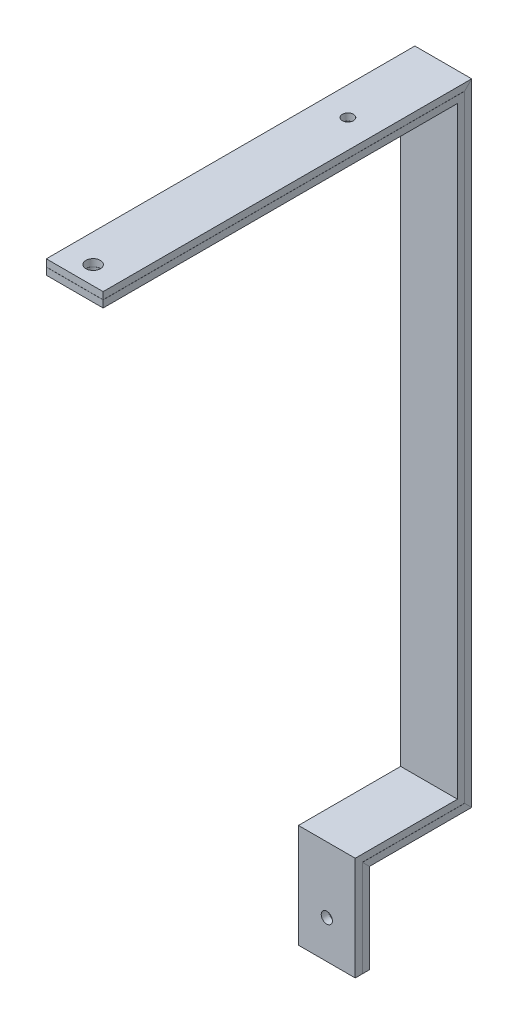
ISO-10303-21;
HEADER;
FILE_DESCRIPTION(('STEP AP214'),'2;1');
FILE_NAME('part.step','',(''),(''),'','','');
FILE_SCHEMA(('AUTOMOTIVE_DESIGN { 1 0 10303 214 1 1 1 1 }'));
ENDSEC;
DATA;
#1=APPLICATION_CONTEXT('core data for automotive mechanical design processes');
#2=APPLICATION_PROTOCOL_DEFINITION('international standard','automotive_design',2000,#1);
#3=PRODUCT_CONTEXT('',#1,'mechanical');
#4=PRODUCT('Part','Part','',(#3));
#5=PRODUCT_RELATED_PRODUCT_CATEGORY('part','',(#4));
#6=PRODUCT_DEFINITION_FORMATION('','',#4);
#7=PRODUCT_DEFINITION_CONTEXT('part definition',#1,'design');
#8=PRODUCT_DEFINITION('design','',#6,#7);
#9=PRODUCT_DEFINITION_SHAPE('','',#8);
#10=(LENGTH_UNIT() NAMED_UNIT(*) SI_UNIT(.MILLI.,.METRE.));
#11=(NAMED_UNIT(*) PLANE_ANGLE_UNIT() SI_UNIT($,.RADIAN.));
#12=(NAMED_UNIT(*) SI_UNIT($,.STERADIAN.) SOLID_ANGLE_UNIT());
#13=UNCERTAINTY_MEASURE_WITH_UNIT(LENGTH_MEASURE(1.E-05),#10,'distance_accuracy_value','');
#14=(GEOMETRIC_REPRESENTATION_CONTEXT(3) GLOBAL_UNCERTAINTY_ASSIGNED_CONTEXT((#13)) GLOBAL_UNIT_ASSIGNED_CONTEXT((#10,
#11,#12)) REPRESENTATION_CONTEXT('',''));
#15=CARTESIAN_POINT('',(0.,0.,0.));
#16=DIRECTION('',(0.,0.,1.));
#17=DIRECTION('',(1.,0.,0.));
#18=AXIS2_PLACEMENT_3D('',#15,#16,#17);
#19=CARTESIAN_POINT('',(-25.4,-3.255,0.));
#20=DIRECTION('',(0.,0.,1.));
#21=DIRECTION('',(1.,0.,0.));
#22=AXIS2_PLACEMENT_3D('',#19,#20,#21);
#23=PLANE('',#22);
#24=DIRECTION('',(0.,-1.,0.));
#25=VECTOR('',#24,1.);
#26=CARTESIAN_POINT('',(25.4,-3.255,0.));
#27=LINE('',#26,#25);
#28=CARTESIAN_POINT('',(25.4,-3.255,0.));
#29=VERTEX_POINT('',#28);
#30=CARTESIAN_POINT('',(25.4,-9.565,0.));
#31=VERTEX_POINT('',#30);
#32=EDGE_CURVE('E153',#29,#31,#27,.T.);
#33=ORIENTED_EDGE('',*,*,#32,.F.);
#34=DIRECTION('',(1.,0.,0.));
#35=VECTOR('',#34,1.);
#36=CARTESIAN_POINT('',(-25.4,-3.255,0.));
#37=LINE('',#36,#35);
#38=CARTESIAN_POINT('',(-25.4,-3.255,0.));
#39=VERTEX_POINT('',#38);
#40=EDGE_CURVE('E12',#39,#29,#37,.T.);
#41=ORIENTED_EDGE('',*,*,#40,.F.);
#42=DIRECTION('',(0.,-1.,0.));
#43=VECTOR('',#42,1.);
#44=CARTESIAN_POINT('',(-25.4,-3.255,0.));
#45=LINE('',#44,#43);
#46=CARTESIAN_POINT('',(-25.4,-9.565,0.));
#47=VERTEX_POINT('',#46);
#48=EDGE_CURVE('E180',#39,#47,#45,.T.);
#49=ORIENTED_EDGE('',*,*,#48,.T.);
#50=DIRECTION('',(1.,0.,0.));
#51=VECTOR('',#50,1.);
#52=CARTESIAN_POINT('',(-25.4,-9.565,0.));
#53=LINE('',#52,#51);
#54=EDGE_CURVE('E105',#47,#31,#53,.T.);
#55=ORIENTED_EDGE('',*,*,#54,.T.);
#56=EDGE_LOOP('',(#33,#41,#49,#55));
#57=FACE_BOUND('',#56,.T.);
#58=ADVANCED_FACE('F43',(#57),#23,.T.);
#59=CARTESIAN_POINT('',(-25.4,-3.255,0.));
#60=DIRECTION('',(0.,1.,0.));
#61=DIRECTION('',(0.,0.,1.));
#62=AXIS2_PLACEMENT_3D('',#59,#60,#61);
#63=PLANE('',#62);
#64=CARTESIAN_POINT('',(7.93595550972163E-12,-3.255,-16.5000000000056));
#65=DIRECTION('',(0.,1.,0.));
#66=DIRECTION('',(0.,0.,1.));
#67=AXIS2_PLACEMENT_3D('',#64,#65,#66);
#68=CIRCLE('',#67,6.49999999999943);
#69=CARTESIAN_POINT('',(7.93595550972163E-12,-3.255,-10.0000000000061));
#70=VERTEX_POINT('',#69);
#71=EDGE_CURVE('E196',#70,#70,#68,.T.);
#72=ORIENTED_EDGE('',*,*,#71,.F.);
#73=EDGE_LOOP('',(#72));
#74=FACE_BOUND('',#73,.T.);
#75=CARTESIAN_POINT('',(0.,-3.255,-244.195));
#76=DIRECTION('',(0.,1.,0.));
#77=DIRECTION('',(0.,0.,1.));
#78=AXIS2_PLACEMENT_3D('',#75,#76,#77);
#79=CIRCLE('',#78,5.);
#80=CARTESIAN_POINT('',(0.,-3.255,-239.195));
#81=VERTEX_POINT('',#80);
#82=EDGE_CURVE('E157',#81,#81,#79,.T.);
#83=ORIENTED_EDGE('',*,*,#82,.F.);
#84=EDGE_LOOP('',(#83));
#85=FACE_BOUND('',#84,.T.);
#86=DIRECTION('',(0.,0.,1.));
#87=VECTOR('',#86,1.);
#88=CARTESIAN_POINT('',(25.4,-3.255,0.));
#89=LINE('',#88,#87);
#90=CARTESIAN_POINT('',(25.4,-3.255,-323.085));
#91=VERTEX_POINT('',#90);
#92=EDGE_CURVE('E178',#91,#29,#89,.T.);
#93=ORIENTED_EDGE('',*,*,#92,.F.);
#94=DIRECTION('',(1.,0.,0.));
#95=VECTOR('',#94,1.);
#96=CARTESIAN_POINT('',(-25.4,-3.255,-323.085));
#97=LINE('',#96,#95);
#98=CARTESIAN_POINT('',(-25.4,-3.255,-323.085));
#99=VERTEX_POINT('',#98);
#100=EDGE_CURVE('E52',#99,#91,#97,.T.);
#101=ORIENTED_EDGE('',*,*,#100,.F.);
#102=DIRECTION('',(0.,0.,1.));
#103=VECTOR('',#102,1.);
#104=CARTESIAN_POINT('',(-25.4,-3.255,0.));
#105=LINE('',#104,#103);
#106=EDGE_CURVE('E143',#99,#39,#105,.T.);
#107=ORIENTED_EDGE('',*,*,#106,.T.);
#108=ORIENTED_EDGE('',*,*,#40,.T.);
#109=EDGE_LOOP('',(#93,#101,#107,#108));
#110=FACE_BOUND('',#109,.T.);
#111=ADVANCED_FACE('F242',(#74,#85,#110),#63,.T.);
#112=CARTESIAN_POINT('',(-25.4,-3.255,-323.085));
#113=DIRECTION('',(0.,0.,-1.));
#114=DIRECTION('',(0.,1.,0.));
#115=AXIS2_PLACEMENT_3D('',#112,#113,#114);
#116=PLANE('',#115);
#117=DIRECTION('',(0.,1.,0.));
#118=VECTOR('',#117,1.);
#119=CARTESIAN_POINT('',(25.4,-3.255,-323.085));
#120=LINE('',#119,#118);
#121=CARTESIAN_POINT('',(25.4,-554.505,-323.085));
#122=VERTEX_POINT('',#121);
#123=EDGE_CURVE('E130',#122,#91,#120,.T.);
#124=ORIENTED_EDGE('',*,*,#123,.F.);
#125=DIRECTION('',(1.,0.,0.));
#126=VECTOR('',#125,1.);
#127=CARTESIAN_POINT('',(-25.4,-554.505,-323.085));
#128=LINE('',#127,#126);
#129=CARTESIAN_POINT('',(-25.4,-554.505,-323.085));
#130=VERTEX_POINT('',#129);
#131=EDGE_CURVE('E125',#130,#122,#128,.T.);
#132=ORIENTED_EDGE('',*,*,#131,.F.);
#133=DIRECTION('',(0.,1.,0.));
#134=VECTOR('',#133,1.);
#135=CARTESIAN_POINT('',(-25.4,-3.255,-323.085));
#136=LINE('',#135,#134);
#137=EDGE_CURVE('E128',#130,#99,#136,.T.);
#138=ORIENTED_EDGE('',*,*,#137,.T.);
#139=ORIENTED_EDGE('',*,*,#100,.T.);
#140=EDGE_LOOP('',(#124,#132,#138,#139));
#141=FACE_BOUND('',#140,.T.);
#142=ADVANCED_FACE('F127',(#141),#116,.T.);
#143=CARTESIAN_POINT('',(-25.4,-554.505,-323.085));
#144=DIRECTION('',(0.,-1.,0.));
#145=DIRECTION('',(0.,0.,-1.));
#146=AXIS2_PLACEMENT_3D('',#143,#144,#145);
#147=PLANE('',#146);
#148=DIRECTION('',(0.,0.,-1.));
#149=VECTOR('',#148,1.);
#150=CARTESIAN_POINT('',(25.4,-554.505,-323.085));
#151=LINE('',#150,#149);
#152=CARTESIAN_POINT('',(25.4,-554.505,-231.681165));
#153=VERTEX_POINT('',#152);
#154=EDGE_CURVE('E175',#153,#122,#151,.T.);
#155=ORIENTED_EDGE('',*,*,#154,.F.);
#156=DIRECTION('',(1.,0.,0.));
#157=VECTOR('',#156,1.);
#158=CARTESIAN_POINT('',(-25.4,-554.505,-231.681165));
#159=LINE('',#158,#157);
#160=CARTESIAN_POINT('',(-25.4,-554.505,-231.681165));
#161=VERTEX_POINT('',#160);
#162=EDGE_CURVE('E135',#161,#153,#159,.T.);
#163=ORIENTED_EDGE('',*,*,#162,.F.);
#164=DIRECTION('',(0.,0.,-1.));
#165=VECTOR('',#164,1.);
#166=CARTESIAN_POINT('',(-25.4,-554.505,-323.085));
#167=LINE('',#166,#165);
#168=EDGE_CURVE('E141',#161,#130,#167,.T.);
#169=ORIENTED_EDGE('',*,*,#168,.T.);
#170=ORIENTED_EDGE('',*,*,#131,.T.);
#171=EDGE_LOOP('',(#155,#163,#169,#170));
#172=FACE_BOUND('',#171,.T.);
#173=ADVANCED_FACE('F145',(#172),#147,.T.);
#174=CARTESIAN_POINT('',(-25.4,-554.505,-231.681165));
#175=DIRECTION('',(0.,0.,-1.));
#176=DIRECTION('',(-1.,0.,0.));
#177=AXIS2_PLACEMENT_3D('',#174,#175,#176);
#178=PLANE('',#177);
#179=CARTESIAN_POINT('',(0.,-606.92,-231.681165));
#180=DIRECTION('',(0.,0.,-1.));
#181=DIRECTION('',(-1.,0.,0.));
#182=AXIS2_PLACEMENT_3D('',#179,#180,#181);
#183=CIRCLE('',#182,5.);
#184=CARTESIAN_POINT('',(-5.,-606.92,-231.681165));
#185=VERTEX_POINT('',#184);
#186=EDGE_CURVE('E206',#185,#185,#183,.T.);
#187=ORIENTED_EDGE('',*,*,#186,.F.);
#188=EDGE_LOOP('',(#187));
#189=FACE_BOUND('',#188,.T.);
#190=DIRECTION('',(0.,1.,0.));
#191=VECTOR('',#190,1.);
#192=CARTESIAN_POINT('',(25.4,-554.505,-231.681165));
#193=LINE('',#192,#191);
#194=CARTESIAN_POINT('',(25.4,-640.92,-231.681165));
#195=VERTEX_POINT('',#194);
#196=EDGE_CURVE('E172',#195,#153,#193,.T.);
#197=ORIENTED_EDGE('',*,*,#196,.F.);
#198=DIRECTION('',(1.,0.,0.));
#199=VECTOR('',#198,1.);
#200=CARTESIAN_POINT('',(-25.4,-640.92,-231.681165));
#201=LINE('',#200,#199);
#202=CARTESIAN_POINT('',(-25.4,-640.92,-231.681165));
#203=VERTEX_POINT('',#202);
#204=EDGE_CURVE('E184',#203,#195,#201,.T.);
#205=ORIENTED_EDGE('',*,*,#204,.F.);
#206=DIRECTION('',(0.,1.,0.));
#207=VECTOR('',#206,1.);
#208=CARTESIAN_POINT('',(-25.4,-554.505,-231.681165));
#209=LINE('',#208,#207);
#210=EDGE_CURVE('E146',#203,#161,#209,.T.);
#211=ORIENTED_EDGE('',*,*,#210,.T.);
#212=ORIENTED_EDGE('',*,*,#162,.T.);
#213=EDGE_LOOP('',(#197,#205,#211,#212));
#214=FACE_BOUND('',#213,.T.);
#215=ADVANCED_FACE('F257',(#189,#214),#178,.T.);
#216=CARTESIAN_POINT('',(-25.4,-640.92,-225.371165));
#217=DIRECTION('',(0.,-1.,0.));
#218=DIRECTION('',(0.,0.,-1.));
#219=AXIS2_PLACEMENT_3D('',#216,#217,#218);
#220=PLANE('',#219);
#221=DIRECTION('',(0.,0.,-1.));
#222=VECTOR('',#221,1.);
#223=CARTESIAN_POINT('',(25.4,-640.92,-225.371165));
#224=LINE('',#223,#222);
#225=CARTESIAN_POINT('',(25.4,-640.92,-225.371165));
#226=VERTEX_POINT('',#225);
#227=EDGE_CURVE('E169',#226,#195,#224,.T.);
#228=ORIENTED_EDGE('',*,*,#227,.F.);
#229=DIRECTION('',(1.,0.,0.));
#230=VECTOR('',#229,1.);
#231=CARTESIAN_POINT('',(-25.4,-640.92,-225.371165));
#232=LINE('',#231,#230);
#233=CARTESIAN_POINT('',(-25.4,-640.92,-225.371165));
#234=VERTEX_POINT('',#233);
#235=EDGE_CURVE('E186',#234,#226,#232,.T.);
#236=ORIENTED_EDGE('',*,*,#235,.F.);
#237=DIRECTION('',(0.,0.,-1.));
#238=VECTOR('',#237,1.);
#239=CARTESIAN_POINT('',(-25.4,-640.92,-225.371165));
#240=LINE('',#239,#238);
#241=EDGE_CURVE('E148',#234,#203,#240,.T.);
#242=ORIENTED_EDGE('',*,*,#241,.T.);
#243=ORIENTED_EDGE('',*,*,#204,.T.);
#244=EDGE_LOOP('',(#228,#236,#242,#243));
#245=FACE_BOUND('',#244,.T.);
#246=ADVANCED_FACE('F225',(#245),#220,.T.);
#247=CARTESIAN_POINT('',(-25.4,-548.195,-225.371165));
#248=DIRECTION('',(0.,0.,1.));
#249=DIRECTION('',(1.,0.,0.));
#250=AXIS2_PLACEMENT_3D('',#247,#248,#249);
#251=PLANE('',#250);
#252=CARTESIAN_POINT('',(0.,-606.92,-225.371165));
#253=DIRECTION('',(0.,0.,1.));
#254=DIRECTION('',(1.,0.,0.));
#255=AXIS2_PLACEMENT_3D('',#252,#253,#254);
#256=CIRCLE('',#255,5.);
#257=CARTESIAN_POINT('',(5.,-606.92,-225.371165));
#258=VERTEX_POINT('',#257);
#259=EDGE_CURVE('E381',#258,#258,#256,.T.);
#260=ORIENTED_EDGE('',*,*,#259,.F.);
#261=EDGE_LOOP('',(#260));
#262=FACE_BOUND('',#261,.T.);
#263=DIRECTION('',(0.,-1.,0.));
#264=VECTOR('',#263,1.);
#265=CARTESIAN_POINT('',(25.4,-548.195,-225.371165));
#266=LINE('',#265,#264);
#267=CARTESIAN_POINT('',(25.4,-548.195,-225.371165));
#268=VERTEX_POINT('',#267);
#269=EDGE_CURVE('E166',#268,#226,#266,.T.);
#270=ORIENTED_EDGE('',*,*,#269,.F.);
#271=DIRECTION('',(1.,0.,0.));
#272=VECTOR('',#271,1.);
#273=CARTESIAN_POINT('',(-25.4,-548.195,-225.371165));
#274=LINE('',#273,#272);
#275=CARTESIAN_POINT('',(-25.4,-548.195,-225.371165));
#276=VERTEX_POINT('',#275);
#277=EDGE_CURVE('E188',#276,#268,#274,.T.);
#278=ORIENTED_EDGE('',*,*,#277,.F.);
#279=DIRECTION('',(0.,-1.,0.));
#280=VECTOR('',#279,1.);
#281=CARTESIAN_POINT('',(-25.4,-548.195,-225.371165));
#282=LINE('',#281,#280);
#283=EDGE_CURVE('E219',#276,#234,#282,.T.);
#284=ORIENTED_EDGE('',*,*,#283,.T.);
#285=ORIENTED_EDGE('',*,*,#235,.T.);
#286=EDGE_LOOP('',(#270,#278,#284,#285));
#287=FACE_BOUND('',#286,.T.);
#288=ADVANCED_FACE('F231',(#262,#287),#251,.T.);
#289=CARTESIAN_POINT('',(-25.4,-548.195,-316.775));
#290=DIRECTION('',(0.,1.,0.));
#291=DIRECTION('',(0.,0.,1.));
#292=AXIS2_PLACEMENT_3D('',#289,#290,#291);
#293=PLANE('',#292);
#294=DIRECTION('',(0.,0.,1.));
#295=VECTOR('',#294,1.);
#296=CARTESIAN_POINT('',(25.4,-548.195,-316.775));
#297=LINE('',#296,#295);
#298=CARTESIAN_POINT('',(25.4,-548.195,-316.775));
#299=VERTEX_POINT('',#298);
#300=EDGE_CURVE('E163',#299,#268,#297,.T.);
#301=ORIENTED_EDGE('',*,*,#300,.F.);
#302=DIRECTION('',(1.,0.,0.));
#303=VECTOR('',#302,1.);
#304=CARTESIAN_POINT('',(-25.4,-548.195,-316.775));
#305=LINE('',#304,#303);
#306=CARTESIAN_POINT('',(-25.4,-548.195,-316.775));
#307=VERTEX_POINT('',#306);
#308=EDGE_CURVE('E190',#307,#299,#305,.T.);
#309=ORIENTED_EDGE('',*,*,#308,.F.);
#310=DIRECTION('',(0.,0.,1.));
#311=VECTOR('',#310,1.);
#312=CARTESIAN_POINT('',(-25.4,-548.195,-316.775));
#313=LINE('',#312,#311);
#314=EDGE_CURVE('E216',#307,#276,#313,.T.);
#315=ORIENTED_EDGE('',*,*,#314,.T.);
#316=ORIENTED_EDGE('',*,*,#277,.T.);
#317=EDGE_LOOP('',(#301,#309,#315,#316));
#318=FACE_BOUND('',#317,.T.);
#319=ADVANCED_FACE('F234',(#318),#293,.T.);
#320=CARTESIAN_POINT('',(-25.4,-9.565,-316.775));
#321=DIRECTION('',(0.,0.,1.));
#322=DIRECTION('',(0.,-1.,0.));
#323=AXIS2_PLACEMENT_3D('',#320,#321,#322);
#324=PLANE('',#323);
#325=DIRECTION('',(0.,-1.,0.));
#326=VECTOR('',#325,1.);
#327=CARTESIAN_POINT('',(25.4,-9.565,-316.775));
#328=LINE('',#327,#326);
#329=CARTESIAN_POINT('',(25.4,-9.565,-316.775));
#330=VERTEX_POINT('',#329);
#331=EDGE_CURVE('E160',#330,#299,#328,.T.);
#332=ORIENTED_EDGE('',*,*,#331,.F.);
#333=DIRECTION('',(1.,0.,0.));
#334=VECTOR('',#333,1.);
#335=CARTESIAN_POINT('',(-25.4,-9.565,-316.775));
#336=LINE('',#335,#334);
#337=CARTESIAN_POINT('',(-25.4,-9.565,-316.775));
#338=VERTEX_POINT('',#337);
#339=EDGE_CURVE('E192',#338,#330,#336,.T.);
#340=ORIENTED_EDGE('',*,*,#339,.F.);
#341=DIRECTION('',(0.,-1.,0.));
#342=VECTOR('',#341,1.);
#343=CARTESIAN_POINT('',(-25.4,-9.565,-316.775));
#344=LINE('',#343,#342);
#345=EDGE_CURVE('E213',#338,#307,#344,.T.);
#346=ORIENTED_EDGE('',*,*,#345,.T.);
#347=ORIENTED_EDGE('',*,*,#308,.T.);
#348=EDGE_LOOP('',(#332,#340,#346,#347));
#349=FACE_BOUND('',#348,.T.);
#350=ADVANCED_FACE('F238',(#349),#324,.T.);
#351=CARTESIAN_POINT('',(-25.4,-9.565,0.));
#352=DIRECTION('',(0.,-1.,0.));
#353=DIRECTION('',(0.,0.,-1.));
#354=AXIS2_PLACEMENT_3D('',#351,#352,#353);
#355=PLANE('',#354);
#356=CARTESIAN_POINT('',(7.93595550972163E-12,-9.565,-16.5000000000056));
#357=DIRECTION('',(0.,-1.,0.));
#358=DIRECTION('',(0.,0.,-1.));
#359=AXIS2_PLACEMENT_3D('',#356,#357,#358);
#360=CIRCLE('',#359,6.49999999999943);
#361=CARTESIAN_POINT('',(7.93595550972163E-12,-9.565,-23.000000000005));
#362=VERTEX_POINT('',#361);
#363=EDGE_CURVE('E46',#362,#362,#360,.T.);
#364=ORIENTED_EDGE('',*,*,#363,.F.);
#365=EDGE_LOOP('',(#364));
#366=FACE_BOUND('',#365,.T.);
#367=CARTESIAN_POINT('',(0.,-9.565,-244.195));
#368=DIRECTION('',(0.,-1.,0.));
#369=DIRECTION('',(0.,0.,-1.));
#370=AXIS2_PLACEMENT_3D('',#367,#368,#369);
#371=CIRCLE('',#370,5.);
#372=CARTESIAN_POINT('',(0.,-9.565,-249.195));
#373=VERTEX_POINT('',#372);
#374=EDGE_CURVE('E194',#373,#373,#371,.T.);
#375=ORIENTED_EDGE('',*,*,#374,.F.);
#376=EDGE_LOOP('',(#375));
#377=FACE_BOUND('',#376,.T.);
#378=DIRECTION('',(0.,0.,-1.));
#379=VECTOR('',#378,1.);
#380=CARTESIAN_POINT('',(25.4,-9.565,0.));
#381=LINE('',#380,#379);
#382=EDGE_CURVE('E156',#31,#330,#381,.T.);
#383=ORIENTED_EDGE('',*,*,#382,.F.);
#384=ORIENTED_EDGE('',*,*,#54,.F.);
#385=DIRECTION('',(0.,0.,-1.));
#386=VECTOR('',#385,1.);
#387=CARTESIAN_POINT('',(-25.4,-9.565,0.));
#388=LINE('',#387,#386);
#389=EDGE_CURVE('E211',#47,#338,#388,.T.);
#390=ORIENTED_EDGE('',*,*,#389,.T.);
#391=ORIENTED_EDGE('',*,*,#339,.T.);
#392=EDGE_LOOP('',(#383,#384,#390,#391));
#393=FACE_BOUND('',#392,.T.);
#394=ADVANCED_FACE('F239',(#366,#377,#393),#355,.T.);
#395=CARTESIAN_POINT('',(-25.4,0.,0.));
#396=DIRECTION('',(1.,0.,0.));
#397=DIRECTION('',(0.,0.,-1.));
#398=AXIS2_PLACEMENT_3D('',#395,#396,#397);
#399=PLANE('',#398);
#400=ORIENTED_EDGE('',*,*,#48,.F.);
#401=ORIENTED_EDGE('',*,*,#106,.F.);
#402=ORIENTED_EDGE('',*,*,#137,.F.);
#403=ORIENTED_EDGE('',*,*,#168,.F.);
#404=ORIENTED_EDGE('',*,*,#210,.F.);
#405=ORIENTED_EDGE('',*,*,#241,.F.);
#406=ORIENTED_EDGE('',*,*,#283,.F.);
#407=ORIENTED_EDGE('',*,*,#314,.F.);
#408=ORIENTED_EDGE('',*,*,#345,.F.);
#409=ORIENTED_EDGE('',*,*,#389,.F.);
#410=EDGE_LOOP('',(#400,#401,#402,#403,#404,#405,#406,#407,#408,#409));
#411=FACE_BOUND('',#410,.T.);
#412=ADVANCED_FACE('F139',(#411),#399,.F.);
#413=CARTESIAN_POINT('',(25.4,0.,0.));
#414=DIRECTION('',(1.,0.,0.));
#415=DIRECTION('',(0.,0.,-1.));
#416=AXIS2_PLACEMENT_3D('',#413,#414,#415);
#417=PLANE('',#416);
#418=ORIENTED_EDGE('',*,*,#32,.T.);
#419=ORIENTED_EDGE('',*,*,#382,.T.);
#420=ORIENTED_EDGE('',*,*,#331,.T.);
#421=ORIENTED_EDGE('',*,*,#300,.T.);
#422=ORIENTED_EDGE('',*,*,#269,.T.);
#423=ORIENTED_EDGE('',*,*,#227,.T.);
#424=ORIENTED_EDGE('',*,*,#196,.T.);
#425=ORIENTED_EDGE('',*,*,#154,.T.);
#426=ORIENTED_EDGE('',*,*,#123,.T.);
#427=ORIENTED_EDGE('',*,*,#92,.T.);
#428=EDGE_LOOP('',(#418,#419,#420,#421,#422,#423,#424,#425,#426,#427));
#429=FACE_BOUND('',#428,.T.);
#430=ADVANCED_FACE('F241',(#429),#417,.T.);
#431=CARTESIAN_POINT('',(0.,-36.845,-244.195));
#432=DIRECTION('',(0.,1.,0.));
#433=DIRECTION('',(0.,0.,1.));
#434=AXIS2_PLACEMENT_3D('',#431,#432,#433);
#435=CYLINDRICAL_SURFACE('',#434,5.);
#436=ORIENTED_EDGE('',*,*,#82,.T.);
#437=EDGE_LOOP('',(#436));
#438=FACE_BOUND('',#437,.T.);
#439=ORIENTED_EDGE('',*,*,#374,.T.);
#440=EDGE_LOOP('',(#439));
#441=FACE_BOUND('',#440,.T.);
#442=ADVANCED_FACE('F280',(#438,#441),#435,.F.);
#443=CARTESIAN_POINT('',(7.93595550972163E-12,-46.845,-16.5000000000056));
#444=DIRECTION('',(0.,1.,0.));
#445=DIRECTION('',(0.,0.,1.));
#446=AXIS2_PLACEMENT_3D('',#443,#444,#445);
#447=CYLINDRICAL_SURFACE('',#446,6.49999999999943);
#448=ORIENTED_EDGE('',*,*,#71,.T.);
#449=EDGE_LOOP('',(#448));
#450=FACE_BOUND('',#449,.T.);
#451=ORIENTED_EDGE('',*,*,#363,.T.);
#452=EDGE_LOOP('',(#451));
#453=FACE_BOUND('',#452,.T.);
#454=ADVANCED_FACE('F277',(#450,#453),#447,.F.);
#455=CARTESIAN_POINT('',(0.,-606.92,-251.371165));
#456=DIRECTION('',(0.,0.,1.));
#457=DIRECTION('',(1.,0.,0.));
#458=AXIS2_PLACEMENT_3D('',#455,#456,#457);
#459=CYLINDRICAL_SURFACE('',#458,5.);
#460=ORIENTED_EDGE('',*,*,#186,.T.);
#461=EDGE_LOOP('',(#460));
#462=FACE_BOUND('',#461,.T.);
#463=ORIENTED_EDGE('',*,*,#259,.T.);
#464=EDGE_LOOP('',(#463));
#465=FACE_BOUND('',#464,.T.);
#466=ADVANCED_FACE('F279',(#462,#465),#459,.F.);
#467=CLOSED_SHELL('',(#58,#111,#142,#173,#215,#246,#288,#319,#350,#394,#412,#430,#442,#454,#466));
#468=MANIFOLD_SOLID_BREP('B2',#467);
#469=CARTESIAN_POINT('',(0.,-640.92,-234.936165));
#470=DIRECTION('',(0.,1.,0.));
#471=DIRECTION('',(1.,0.,0.));
#472=AXIS2_PLACEMENT_3D('',#469,#470,#471);
#473=PLANE('',#472);
#474=DIRECTION('',(0.,0.,-1.));
#475=VECTOR('',#474,1.);
#476=CARTESIAN_POINT('',(25.4,-640.92,-238.091165));
#477=LINE('',#476,#475);
#478=CARTESIAN_POINT('',(25.4,-640.92,-231.781165));
#479=VERTEX_POINT('',#478);
#480=CARTESIAN_POINT('',(25.4,-640.92,-238.091165));
#481=VERTEX_POINT('',#480);
#482=EDGE_CURVE('E461',#479,#481,#477,.T.);
#483=ORIENTED_EDGE('',*,*,#482,.F.);
#484=DIRECTION('',(1.,0.,0.));
#485=VECTOR('',#484,1.);
#486=CARTESIAN_POINT('',(-25.4,-640.92,-231.781165));
#487=LINE('',#486,#485);
#488=CARTESIAN_POINT('',(-25.4,-640.92,-231.781165));
#489=VERTEX_POINT('',#488);
#490=EDGE_CURVE('E464',#489,#479,#487,.T.);
#491=ORIENTED_EDGE('',*,*,#490,.F.);
#492=DIRECTION('',(0.,0.,1.));
#493=VECTOR('',#492,1.);
#494=CARTESIAN_POINT('',(-25.4,-640.92,-238.091165));
#495=LINE('',#494,#493);
#496=CARTESIAN_POINT('',(-25.4,-640.92,-238.091165));
#497=VERTEX_POINT('',#496);
#498=EDGE_CURVE('E445',#497,#489,#495,.T.);
#499=ORIENTED_EDGE('',*,*,#498,.F.);
#500=DIRECTION('',(-1.,0.,0.));
#501=VECTOR('',#500,1.);
#502=CARTESIAN_POINT('',(-25.4,-640.92,-238.091165));
#503=LINE('',#502,#501);
#504=EDGE_CURVE('E452',#481,#497,#503,.T.);
#505=ORIENTED_EDGE('',*,*,#504,.F.);
#506=EDGE_LOOP('',(#483,#491,#499,#505));
#507=FACE_BOUND('',#506,.T.);
#508=ADVANCED_FACE('F386',(#507),#473,.F.);
#509=CARTESIAN_POINT('',(0.,0.,0.));
#510=DIRECTION('',(0.,0.,1.));
#511=DIRECTION('',(1.,0.,0.));
#512=AXIS2_PLACEMENT_3D('',#509,#510,#511);
#513=PLANE('',#512);
#514=DIRECTION('',(0.,1.,0.));
#515=VECTOR('',#514,1.);
#516=CARTESIAN_POINT('',(25.4,3.155,0.));
#517=LINE('',#516,#515);
#518=CARTESIAN_POINT('',(25.4,-3.155,0.));
#519=VERTEX_POINT('',#518);
#520=CARTESIAN_POINT('',(25.4,3.155,0.));
#521=VERTEX_POINT('',#520);
#522=EDGE_CURVE('E517',#519,#521,#517,.T.);
#523=ORIENTED_EDGE('',*,*,#522,.T.);
#524=DIRECTION('',(-1.,0.,0.));
#525=VECTOR('',#524,1.);
#526=CARTESIAN_POINT('',(-25.4,3.155,0.));
#527=LINE('',#526,#525);
#528=CARTESIAN_POINT('',(-25.4,3.155,0.));
#529=VERTEX_POINT('',#528);
#530=EDGE_CURVE('E514',#521,#529,#527,.T.);
#531=ORIENTED_EDGE('',*,*,#530,.T.);
#532=DIRECTION('',(0.,-1.,0.));
#533=VECTOR('',#532,1.);
#534=CARTESIAN_POINT('',(-25.4,3.155,0.));
#535=LINE('',#534,#533);
#536=CARTESIAN_POINT('',(-25.4,-3.155,0.));
#537=VERTEX_POINT('',#536);
#538=EDGE_CURVE('E503',#529,#537,#535,.T.);
#539=ORIENTED_EDGE('',*,*,#538,.T.);
#540=DIRECTION('',(1.,0.,0.));
#541=VECTOR('',#540,1.);
#542=CARTESIAN_POINT('',(-25.4,-3.155,0.));
#543=LINE('',#542,#541);
#544=EDGE_CURVE('E506',#537,#519,#543,.T.);
#545=ORIENTED_EDGE('',*,*,#544,.T.);
#546=EDGE_LOOP('',(#523,#531,#539,#545));
#547=FACE_BOUND('',#546,.T.);
#548=ADVANCED_FACE('F616',(#547),#513,.T.);
#549=CARTESIAN_POINT('',(-25.4,-554.1895,-238.091165));
#550=DIRECTION('',(1.,0.,0.));
#551=DIRECTION('',(0.,0.,-1.));
#552=AXIS2_PLACEMENT_3D('',#549,#550,#551);
#553=PLANE('',#552);
#554=DIRECTION('',(0.,-0.707106781186547,-0.707106781186547));
#555=VECTOR('',#554,1.);
#556=CARTESIAN_POINT('',(-25.4,-606.8246675,-284.0008325));
#557=LINE('',#556,#555);
#558=CARTESIAN_POINT('',(-25.4,-554.605,-231.781165));
#559=VERTEX_POINT('',#558);
#560=CARTESIAN_POINT('',(-25.4,-560.915,-238.091165));
#561=VERTEX_POINT('',#560);
#562=EDGE_CURVE('E468',#559,#561,#557,.T.);
#563=ORIENTED_EDGE('',*,*,#562,.T.);
#564=DIRECTION('',(0.,-1.,0.));
#565=VECTOR('',#564,1.);
#566=CARTESIAN_POINT('',(-25.4,-554.1895,-238.091165));
#567=LINE('',#566,#565);
#568=EDGE_CURVE('E455',#561,#497,#567,.T.);
#569=ORIENTED_EDGE('',*,*,#568,.T.);
#570=ORIENTED_EDGE('',*,*,#498,.T.);
#571=DIRECTION('',(0.,-1.,0.));
#572=VECTOR('',#571,1.);
#573=CARTESIAN_POINT('',(-25.4,-554.1895,-231.781165));
#574=LINE('',#573,#572);
#575=EDGE_CURVE('E471',#559,#489,#574,.T.);
#576=ORIENTED_EDGE('',*,*,#575,.F.);
#577=EDGE_LOOP('',(#563,#569,#570,#576));
#578=FACE_BOUND('',#577,.T.);
#579=ADVANCED_FACE('F467',(#578),#553,.F.);
#580=CARTESIAN_POINT('',(-25.4,-554.1895,-231.781165));
#581=DIRECTION('',(0.,0.,-1.));
#582=DIRECTION('',(-1.,0.,0.));
#583=AXIS2_PLACEMENT_3D('',#580,#581,#582);
#584=PLANE('',#583);
#585=CARTESIAN_POINT('',(0.,-606.92,-231.781165));
#586=DIRECTION('',(0.,0.,-1.));
#587=DIRECTION('',(-1.,0.,0.));
#588=AXIS2_PLACEMENT_3D('',#585,#586,#587);
#589=CIRCLE('',#588,5.);
#590=CARTESIAN_POINT('',(-5.,-606.92,-231.781165));
#591=VERTEX_POINT('',#590);
#592=EDGE_CURVE('E490',#591,#591,#589,.T.);
#593=ORIENTED_EDGE('',*,*,#592,.T.);
#594=EDGE_LOOP('',(#593));
#595=FACE_BOUND('',#594,.T.);
#596=DIRECTION('',(-1.,0.,0.));
#597=VECTOR('',#596,1.);
#598=CARTESIAN_POINT('',(-25.4,-554.605,-231.781165));
#599=LINE('',#598,#597);
#600=CARTESIAN_POINT('',(25.4,-554.605,-231.781165));
#601=VERTEX_POINT('',#600);
#602=EDGE_CURVE('E542',#601,#559,#599,.T.);
#603=ORIENTED_EDGE('',*,*,#602,.T.);
#604=ORIENTED_EDGE('',*,*,#575,.T.);
#605=ORIENTED_EDGE('',*,*,#490,.T.);
#606=DIRECTION('',(0.,-1.,0.));
#607=VECTOR('',#606,1.);
#608=CARTESIAN_POINT('',(25.4,-554.1895,-231.781165));
#609=LINE('',#608,#607);
#610=EDGE_CURVE('E476',#601,#479,#609,.T.);
#611=ORIENTED_EDGE('',*,*,#610,.F.);
#612=EDGE_LOOP('',(#603,#604,#605,#611));
#613=FACE_BOUND('',#612,.T.);
#614=ADVANCED_FACE('F575',(#595,#613),#584,.F.);
#615=CARTESIAN_POINT('',(25.4,-554.1895,-238.091165));
#616=DIRECTION('',(-1.,0.,0.));
#617=DIRECTION('',(0.,0.,1.));
#618=AXIS2_PLACEMENT_3D('',#615,#616,#617);
#619=PLANE('',#618);
#620=DIRECTION('',(0.,0.707106781186547,0.707106781186547));
#621=VECTOR('',#620,1.);
#622=CARTESIAN_POINT('',(25.4,-606.8246675,-284.0008325));
#623=LINE('',#622,#621);
#624=CARTESIAN_POINT('',(25.4,-560.915,-238.091165));
#625=VERTEX_POINT('',#624);
#626=EDGE_CURVE('E555',#625,#601,#623,.T.);
#627=ORIENTED_EDGE('',*,*,#626,.T.);
#628=ORIENTED_EDGE('',*,*,#610,.T.);
#629=ORIENTED_EDGE('',*,*,#482,.T.);
#630=DIRECTION('',(0.,-1.,0.));
#631=VECTOR('',#630,1.);
#632=CARTESIAN_POINT('',(25.4,-554.1895,-238.091165));
#633=LINE('',#632,#631);
#634=EDGE_CURVE('E458',#625,#481,#633,.T.);
#635=ORIENTED_EDGE('',*,*,#634,.F.);
#636=EDGE_LOOP('',(#627,#628,#629,#635));
#637=FACE_BOUND('',#636,.T.);
#638=ADVANCED_FACE('F573',(#637),#619,.F.);
#639=CARTESIAN_POINT('',(-25.4,-554.1895,-238.091165));
#640=DIRECTION('',(0.,0.,1.));
#641=DIRECTION('',(1.,0.,0.));
#642=AXIS2_PLACEMENT_3D('',#639,#640,#641);
#643=PLANE('',#642);
#644=CARTESIAN_POINT('',(0.,-606.92,-238.091165));
#645=DIRECTION('',(0.,0.,1.));
#646=DIRECTION('',(1.,0.,0.));
#647=AXIS2_PLACEMENT_3D('',#644,#645,#646);
#648=CIRCLE('',#647,5.);
#649=CARTESIAN_POINT('',(5.,-606.92,-238.091165));
#650=VERTEX_POINT('',#649);
#651=EDGE_CURVE('E389',#650,#650,#648,.T.);
#652=ORIENTED_EDGE('',*,*,#651,.T.);
#653=EDGE_LOOP('',(#652));
#654=FACE_BOUND('',#653,.T.);
#655=DIRECTION('',(1.,0.,0.));
#656=VECTOR('',#655,1.);
#657=CARTESIAN_POINT('',(-25.4,-560.915,-238.091165));
#658=LINE('',#657,#656);
#659=EDGE_CURVE('E558',#561,#625,#658,.T.);
#660=ORIENTED_EDGE('',*,*,#659,.T.);
#661=ORIENTED_EDGE('',*,*,#634,.T.);
#662=ORIENTED_EDGE('',*,*,#504,.T.);
#663=ORIENTED_EDGE('',*,*,#568,.F.);
#664=EDGE_LOOP('',(#660,#661,#662,#663));
#665=FACE_BOUND('',#664,.T.);
#666=ADVANCED_FACE('F454',(#654,#665),#643,.F.);
#667=CARTESIAN_POINT('',(-25.4,-560.915,-329.9105));
#668=DIRECTION('',(0.,1.,0.));
#669=DIRECTION('',(0.,0.,1.));
#670=AXIS2_PLACEMENT_3D('',#667,#668,#669);
#671=PLANE('',#670);
#672=DIRECTION('',(0.,0.,1.));
#673=VECTOR('',#672,1.);
#674=CARTESIAN_POINT('',(-25.4,-560.915,-329.9105));
#675=LINE('',#674,#673);
#676=CARTESIAN_POINT('',(-25.4,-560.915,-329.495));
#677=VERTEX_POINT('',#676);
#678=EDGE_CURVE('E565',#677,#561,#675,.T.);
#679=ORIENTED_EDGE('',*,*,#678,.F.);
#680=DIRECTION('',(1.,0.,0.));
#681=VECTOR('',#680,1.);
#682=CARTESIAN_POINT('',(-25.4,-560.915,-329.495));
#683=LINE('',#682,#681);
#684=CARTESIAN_POINT('',(25.4,-560.915,-329.495));
#685=VERTEX_POINT('',#684);
#686=EDGE_CURVE('E534',#677,#685,#683,.T.);
#687=ORIENTED_EDGE('',*,*,#686,.T.);
#688=DIRECTION('',(0.,0.,1.));
#689=VECTOR('',#688,1.);
#690=CARTESIAN_POINT('',(25.4,-560.915,-329.9105));
#691=LINE('',#690,#689);
#692=EDGE_CURVE('E470',#685,#625,#691,.T.);
#693=ORIENTED_EDGE('',*,*,#692,.T.);
#694=ORIENTED_EDGE('',*,*,#659,.F.);
#695=EDGE_LOOP('',(#679,#687,#693,#694));
#696=FACE_BOUND('',#695,.T.);
#697=ADVANCED_FACE('F584',(#696),#671,.F.);
#698=CARTESIAN_POINT('',(25.4,-560.915,-329.9105));
#699=DIRECTION('',(-1.,0.,0.));
#700=DIRECTION('',(0.,0.,1.));
#701=AXIS2_PLACEMENT_3D('',#698,#699,#700);
#702=PLANE('',#701);
#703=ORIENTED_EDGE('',*,*,#692,.F.);
#704=DIRECTION('',(0.,0.707106781186548,0.707106781186548));
#705=VECTOR('',#704,1.);
#706=CARTESIAN_POINT('',(25.4,-278.67225,-47.25225));
#707=LINE('',#706,#705);
#708=CARTESIAN_POINT('',(25.4,-554.605,-323.185));
#709=VERTEX_POINT('',#708);
#710=EDGE_CURVE('E531',#685,#709,#707,.T.);
#711=ORIENTED_EDGE('',*,*,#710,.T.);
#712=DIRECTION('',(0.,0.,1.));
#713=VECTOR('',#712,1.);
#714=CARTESIAN_POINT('',(25.4,-554.605,-329.9105));
#715=LINE('',#714,#713);
#716=EDGE_CURVE('E474',#709,#601,#715,.T.);
#717=ORIENTED_EDGE('',*,*,#716,.T.);
#718=ORIENTED_EDGE('',*,*,#626,.F.);
#719=EDGE_LOOP('',(#703,#711,#717,#718));
#720=FACE_BOUND('',#719,.T.);
#721=ADVANCED_FACE('F587',(#720),#702,.F.);
#722=CARTESIAN_POINT('',(-25.4,-554.605,-329.9105));
#723=DIRECTION('',(0.,-1.,0.));
#724=DIRECTION('',(0.,0.,-1.));
#725=AXIS2_PLACEMENT_3D('',#722,#723,#724);
#726=PLANE('',#725);
#727=ORIENTED_EDGE('',*,*,#716,.F.);
#728=DIRECTION('',(-1.,0.,0.));
#729=VECTOR('',#728,1.);
#730=CARTESIAN_POINT('',(-25.4,-554.605,-323.185));
#731=LINE('',#730,#729);
#732=CARTESIAN_POINT('',(-25.4,-554.605,-323.185));
#733=VERTEX_POINT('',#732);
#734=EDGE_CURVE('E507',#709,#733,#731,.T.);
#735=ORIENTED_EDGE('',*,*,#734,.T.);
#736=DIRECTION('',(0.,0.,1.));
#737=VECTOR('',#736,1.);
#738=CARTESIAN_POINT('',(-25.4,-554.605,-329.9105));
#739=LINE('',#738,#737);
#740=EDGE_CURVE('E562',#733,#559,#739,.T.);
#741=ORIENTED_EDGE('',*,*,#740,.T.);
#742=ORIENTED_EDGE('',*,*,#602,.F.);
#743=EDGE_LOOP('',(#727,#735,#741,#742));
#744=FACE_BOUND('',#743,.T.);
#745=ADVANCED_FACE('F579',(#744),#726,.F.);
#746=CARTESIAN_POINT('',(-25.4,-560.915,-329.9105));
#747=DIRECTION('',(1.,0.,0.));
#748=DIRECTION('',(0.,0.,-1.));
#749=AXIS2_PLACEMENT_3D('',#746,#747,#748);
#750=PLANE('',#749);
#751=ORIENTED_EDGE('',*,*,#740,.F.);
#752=DIRECTION('',(0.,-0.707106781186548,-0.707106781186548));
#753=VECTOR('',#752,1.);
#754=CARTESIAN_POINT('',(-25.4,-278.67225,-47.25225));
#755=LINE('',#754,#753);
#756=EDGE_CURVE('E537',#733,#677,#755,.T.);
#757=ORIENTED_EDGE('',*,*,#756,.T.);
#758=ORIENTED_EDGE('',*,*,#678,.T.);
#759=ORIENTED_EDGE('',*,*,#562,.F.);
#760=EDGE_LOOP('',(#751,#757,#758,#759));
#761=FACE_BOUND('',#760,.T.);
#762=ADVANCED_FACE('F581',(#761),#750,.F.);
#763=CARTESIAN_POINT('',(-25.4,3.57049999999996,-329.495));
#764=DIRECTION('',(0.,0.,1.));
#765=DIRECTION('',(1.,0.,0.));
#766=AXIS2_PLACEMENT_3D('',#763,#764,#765);
#767=PLANE('',#766);
#768=DIRECTION('',(0.,-1.,0.));
#769=VECTOR('',#768,1.);
#770=CARTESIAN_POINT('',(-25.4,3.57049999999996,-329.495));
#771=LINE('',#770,#769);
#772=CARTESIAN_POINT('',(-25.4,3.15499999999998,-329.495));
#773=VERTEX_POINT('',#772);
#774=EDGE_CURVE('E548',#773,#677,#771,.T.);
#775=ORIENTED_EDGE('',*,*,#774,.F.);
#776=DIRECTION('',(1.,0.,0.));
#777=VECTOR('',#776,1.);
#778=CARTESIAN_POINT('',(-25.4,3.155,-329.495));
#779=LINE('',#778,#777);
#780=CARTESIAN_POINT('',(25.4,3.15499999999998,-329.495));
#781=VERTEX_POINT('',#780);
#782=EDGE_CURVE('E499',#773,#781,#779,.T.);
#783=ORIENTED_EDGE('',*,*,#782,.T.);
#784=DIRECTION('',(0.,-1.,0.));
#785=VECTOR('',#784,1.);
#786=CARTESIAN_POINT('',(25.4,3.57049999999996,-329.495));
#787=LINE('',#786,#785);
#788=EDGE_CURVE('E538',#781,#685,#787,.T.);
#789=ORIENTED_EDGE('',*,*,#788,.T.);
#790=ORIENTED_EDGE('',*,*,#686,.F.);
#791=EDGE_LOOP('',(#775,#783,#789,#790));
#792=FACE_BOUND('',#791,.T.);
#793=ADVANCED_FACE('F622',(#792),#767,.F.);
#794=CARTESIAN_POINT('',(25.4,3.57049999999996,-329.495));
#795=DIRECTION('',(-1.,0.,0.));
#796=DIRECTION('',(0.,0.,1.));
#797=AXIS2_PLACEMENT_3D('',#794,#795,#796);
#798=PLANE('',#797);
#799=ORIENTED_EDGE('',*,*,#788,.F.);
#800=DIRECTION('',(0.,-0.707106781186548,0.707106781186548));
#801=VECTOR('',#800,1.);
#802=CARTESIAN_POINT('',(25.4,-161.5925,-164.7475));
#803=LINE('',#802,#801);
#804=CARTESIAN_POINT('',(25.4,-3.15500000000004,-323.185));
#805=VERTEX_POINT('',#804);
#806=EDGE_CURVE('E395',#781,#805,#803,.T.);
#807=ORIENTED_EDGE('',*,*,#806,.T.);
#808=DIRECTION('',(0.,-1.,0.));
#809=VECTOR('',#808,1.);
#810=CARTESIAN_POINT('',(25.4,3.57049999999996,-323.185));
#811=LINE('',#810,#809);
#812=EDGE_CURVE('E541',#805,#709,#811,.T.);
#813=ORIENTED_EDGE('',*,*,#812,.T.);
#814=ORIENTED_EDGE('',*,*,#710,.F.);
#815=EDGE_LOOP('',(#799,#807,#813,#814));
#816=FACE_BOUND('',#815,.T.);
#817=ADVANCED_FACE('F590',(#816),#798,.F.);
#818=CARTESIAN_POINT('',(-25.4,3.57049999999996,-323.185));
#819=DIRECTION('',(0.,0.,-1.));
#820=DIRECTION('',(-1.,0.,0.));
#821=AXIS2_PLACEMENT_3D('',#818,#819,#820);
#822=PLANE('',#821);
#823=ORIENTED_EDGE('',*,*,#812,.F.);
#824=DIRECTION('',(-1.,0.,0.));
#825=VECTOR('',#824,1.);
#826=CARTESIAN_POINT('',(-25.4,-3.155,-323.185));
#827=LINE('',#826,#825);
#828=CARTESIAN_POINT('',(-25.4,-3.15500000000005,-323.185));
#829=VERTEX_POINT('',#828);
#830=EDGE_CURVE('E41',#805,#829,#827,.T.);
#831=ORIENTED_EDGE('',*,*,#830,.T.);
#832=DIRECTION('',(0.,-1.,0.));
#833=VECTOR('',#832,1.);
#834=CARTESIAN_POINT('',(-25.4,3.57049999999996,-323.185));
#835=LINE('',#834,#833);
#836=EDGE_CURVE('E545',#829,#733,#835,.T.);
#837=ORIENTED_EDGE('',*,*,#836,.T.);
#838=ORIENTED_EDGE('',*,*,#734,.F.);
#839=EDGE_LOOP('',(#823,#831,#837,#838));
#840=FACE_BOUND('',#839,.T.);
#841=ADVANCED_FACE('F592',(#840),#822,.F.);
#842=CARTESIAN_POINT('',(-25.4,3.57049999999996,-329.495));
#843=DIRECTION('',(1.,0.,0.));
#844=DIRECTION('',(0.,0.,-1.));
#845=AXIS2_PLACEMENT_3D('',#842,#843,#844);
#846=PLANE('',#845);
#847=ORIENTED_EDGE('',*,*,#836,.F.);
#848=DIRECTION('',(0.,0.707106781186548,-0.707106781186548));
#849=VECTOR('',#848,1.);
#850=CARTESIAN_POINT('',(-25.4,-161.5925,-164.7475));
#851=LINE('',#850,#849);
#852=EDGE_CURVE('E502',#829,#773,#851,.T.);
#853=ORIENTED_EDGE('',*,*,#852,.T.);
#854=ORIENTED_EDGE('',*,*,#774,.T.);
#855=ORIENTED_EDGE('',*,*,#756,.F.);
#856=EDGE_LOOP('',(#847,#853,#854,#855));
#857=FACE_BOUND('',#856,.T.);
#858=ADVANCED_FACE('F596',(#857),#846,.F.);
#859=CARTESIAN_POINT('',(-25.4,3.155,0.));
#860=DIRECTION('',(0.,-1.,0.));
#861=DIRECTION('',(0.,0.,-1.));
#862=AXIS2_PLACEMENT_3D('',#859,#860,#861);
#863=PLANE('',#862);
#864=CARTESIAN_POINT('',(7.93595550972163E-12,3.155,-16.5000000000056));
#865=DIRECTION('',(0.,1.,0.));
#866=DIRECTION('',(0.,0.,1.));
#867=AXIS2_PLACEMENT_3D('',#864,#865,#866);
#868=CIRCLE('',#867,6.49999999999943);
#869=CARTESIAN_POINT('',(7.93595550972163E-12,3.155,-10.0000000000061));
#870=VERTEX_POINT('',#869);
#871=EDGE_CURVE('E484',#870,#870,#868,.T.);
#872=ORIENTED_EDGE('',*,*,#871,.F.);
#873=EDGE_LOOP('',(#872));
#874=FACE_BOUND('',#873,.T.);
#875=CARTESIAN_POINT('',(0.,3.155,-244.195));
#876=DIRECTION('',(0.,1.,0.));
#877=DIRECTION('',(0.,0.,1.));
#878=AXIS2_PLACEMENT_3D('',#875,#876,#877);
#879=CIRCLE('',#878,5.);
#880=CARTESIAN_POINT('',(0.,3.155,-239.195));
#881=VERTEX_POINT('',#880);
#882=EDGE_CURVE('E481',#881,#881,#879,.T.);
#883=ORIENTED_EDGE('',*,*,#882,.F.);
#884=EDGE_LOOP('',(#883));
#885=FACE_BOUND('',#884,.T.);
#886=DIRECTION('',(0.,0.,-1.));
#887=VECTOR('',#886,1.);
#888=CARTESIAN_POINT('',(-25.4,3.155,0.));
#889=LINE('',#888,#887);
#890=EDGE_CURVE('E511',#529,#773,#889,.T.);
#891=ORIENTED_EDGE('',*,*,#890,.F.);
#892=ORIENTED_EDGE('',*,*,#530,.F.);
#893=DIRECTION('',(0.,0.,-1.));
#894=VECTOR('',#893,1.);
#895=CARTESIAN_POINT('',(25.4,3.155,0.));
#896=LINE('',#895,#894);
#897=EDGE_CURVE('E520',#521,#781,#896,.T.);
#898=ORIENTED_EDGE('',*,*,#897,.T.);
#899=ORIENTED_EDGE('',*,*,#782,.F.);
#900=EDGE_LOOP('',(#891,#892,#898,#899));
#901=FACE_BOUND('',#900,.T.);
#902=ADVANCED_FACE('F619',(#874,#885,#901),#863,.F.);
#903=CARTESIAN_POINT('',(25.4,3.155,0.));
#904=DIRECTION('',(-1.,0.,0.));
#905=DIRECTION('',(0.,0.,1.));
#906=AXIS2_PLACEMENT_3D('',#903,#904,#905);
#907=PLANE('',#906);
#908=ORIENTED_EDGE('',*,*,#897,.F.);
#909=ORIENTED_EDGE('',*,*,#522,.F.);
#910=DIRECTION('',(0.,0.,-1.));
#911=VECTOR('',#910,1.);
#912=CARTESIAN_POINT('',(25.4,-3.155,0.));
#913=LINE('',#912,#911);
#914=EDGE_CURVE('E510',#519,#805,#913,.T.);
#915=ORIENTED_EDGE('',*,*,#914,.T.);
#916=ORIENTED_EDGE('',*,*,#806,.F.);
#917=EDGE_LOOP('',(#908,#909,#915,#916));
#918=FACE_BOUND('',#917,.T.);
#919=ADVANCED_FACE('F642',(#918),#907,.F.);
#920=CARTESIAN_POINT('',(-25.4,-3.155,0.));
#921=DIRECTION('',(0.,1.,0.));
#922=DIRECTION('',(0.,0.,1.));
#923=AXIS2_PLACEMENT_3D('',#920,#921,#922);
#924=PLANE('',#923);
#925=CARTESIAN_POINT('',(7.93595550972163E-12,-3.155,-16.5000000000056));
#926=DIRECTION('',(0.,1.,0.));
#927=DIRECTION('',(0.,0.,1.));
#928=AXIS2_PLACEMENT_3D('',#925,#926,#927);
#929=CIRCLE('',#928,6.49999999999943);
#930=CARTESIAN_POINT('',(7.93595550972163E-12,-3.155,-10.0000000000061));
#931=VERTEX_POINT('',#930);
#932=EDGE_CURVE('E482',#931,#931,#929,.T.);
#933=ORIENTED_EDGE('',*,*,#932,.T.);
#934=EDGE_LOOP('',(#933));
#935=FACE_BOUND('',#934,.T.);
#936=CARTESIAN_POINT('',(0.,-3.155,-244.195));
#937=DIRECTION('',(0.,1.,0.));
#938=DIRECTION('',(0.,0.,1.));
#939=AXIS2_PLACEMENT_3D('',#936,#937,#938);
#940=CIRCLE('',#939,5.);
#941=CARTESIAN_POINT('',(0.,-3.155,-239.195));
#942=VERTEX_POINT('',#941);
#943=EDGE_CURVE('E462',#942,#942,#940,.T.);
#944=ORIENTED_EDGE('',*,*,#943,.T.);
#945=EDGE_LOOP('',(#944));
#946=FACE_BOUND('',#945,.T.);
#947=ORIENTED_EDGE('',*,*,#914,.F.);
#948=ORIENTED_EDGE('',*,*,#544,.F.);
#949=DIRECTION('',(0.,0.,-1.));
#950=VECTOR('',#949,1.);
#951=CARTESIAN_POINT('',(-25.4,-3.155,0.));
#952=LINE('',#951,#950);
#953=EDGE_CURVE('E508',#537,#829,#952,.T.);
#954=ORIENTED_EDGE('',*,*,#953,.T.);
#955=ORIENTED_EDGE('',*,*,#830,.F.);
#956=EDGE_LOOP('',(#947,#948,#954,#955));
#957=FACE_BOUND('',#956,.T.);
#958=ADVANCED_FACE('F633',(#935,#946,#957),#924,.F.);
#959=CARTESIAN_POINT('',(-25.4,3.155,0.));
#960=DIRECTION('',(1.,0.,0.));
#961=DIRECTION('',(0.,0.,-1.));
#962=AXIS2_PLACEMENT_3D('',#959,#960,#961);
#963=PLANE('',#962);
#964=ORIENTED_EDGE('',*,*,#953,.F.);
#965=ORIENTED_EDGE('',*,*,#538,.F.);
#966=ORIENTED_EDGE('',*,*,#890,.T.);
#967=ORIENTED_EDGE('',*,*,#852,.F.);
#968=EDGE_LOOP('',(#964,#965,#966,#967));
#969=FACE_BOUND('',#968,.T.);
#970=ADVANCED_FACE('F613',(#969),#963,.F.);
#971=CARTESIAN_POINT('',(0.,-36.845,-244.195));
#972=DIRECTION('',(0.,1.,0.));
#973=DIRECTION('',(0.,0.,1.));
#974=AXIS2_PLACEMENT_3D('',#971,#972,#973);
#975=CYLINDRICAL_SURFACE('',#974,5.);
#976=ORIENTED_EDGE('',*,*,#882,.T.);
#977=EDGE_LOOP('',(#976));
#978=FACE_BOUND('',#977,.T.);
#979=ORIENTED_EDGE('',*,*,#943,.F.);
#980=EDGE_LOOP('',(#979));
#981=FACE_BOUND('',#980,.T.);
#982=ADVANCED_FACE('F632',(#978,#981),#975,.F.);
#983=CARTESIAN_POINT('',(7.93595550972163E-12,-46.845,-16.5000000000056));
#984=DIRECTION('',(0.,1.,0.));
#985=DIRECTION('',(0.,0.,1.));
#986=AXIS2_PLACEMENT_3D('',#983,#984,#985);
#987=CYLINDRICAL_SURFACE('',#986,6.49999999999943);
#988=ORIENTED_EDGE('',*,*,#871,.T.);
#989=EDGE_LOOP('',(#988));
#990=FACE_BOUND('',#989,.T.);
#991=ORIENTED_EDGE('',*,*,#932,.F.);
#992=EDGE_LOOP('',(#991));
#993=FACE_BOUND('',#992,.T.);
#994=ADVANCED_FACE('F639',(#990,#993),#987,.F.);
#995=CARTESIAN_POINT('',(0.,-606.92,-251.371165));
#996=DIRECTION('',(0.,0.,1.));
#997=DIRECTION('',(1.,0.,0.));
#998=AXIS2_PLACEMENT_3D('',#995,#996,#997);
#999=CYLINDRICAL_SURFACE('',#998,5.);
#1000=ORIENTED_EDGE('',*,*,#651,.F.);
#1001=EDGE_LOOP('',(#1000));
#1002=FACE_BOUND('',#1001,.T.);
#1003=ORIENTED_EDGE('',*,*,#592,.F.);
#1004=EDGE_LOOP('',(#1003));
#1005=FACE_BOUND('',#1004,.T.);
#1006=ADVANCED_FACE('F686',(#1002,#1005),#999,.F.);
#1007=CLOSED_SHELL('',(#508,#548,#579,#614,#638,#666,#697,#721,#745,#762,#793,#817,#841,#858,
#902,#919,#958,#970,#982,#994,#1006));
#1008=MANIFOLD_SOLID_BREP('B6',#1007);
#1009=ADVANCED_BREP_SHAPE_REPRESENTATION('',(#18,#468,#1008),#14);
#1010=SHAPE_DEFINITION_REPRESENTATION(#9,#1009);
ENDSEC;
END-ISO-10303-21;
